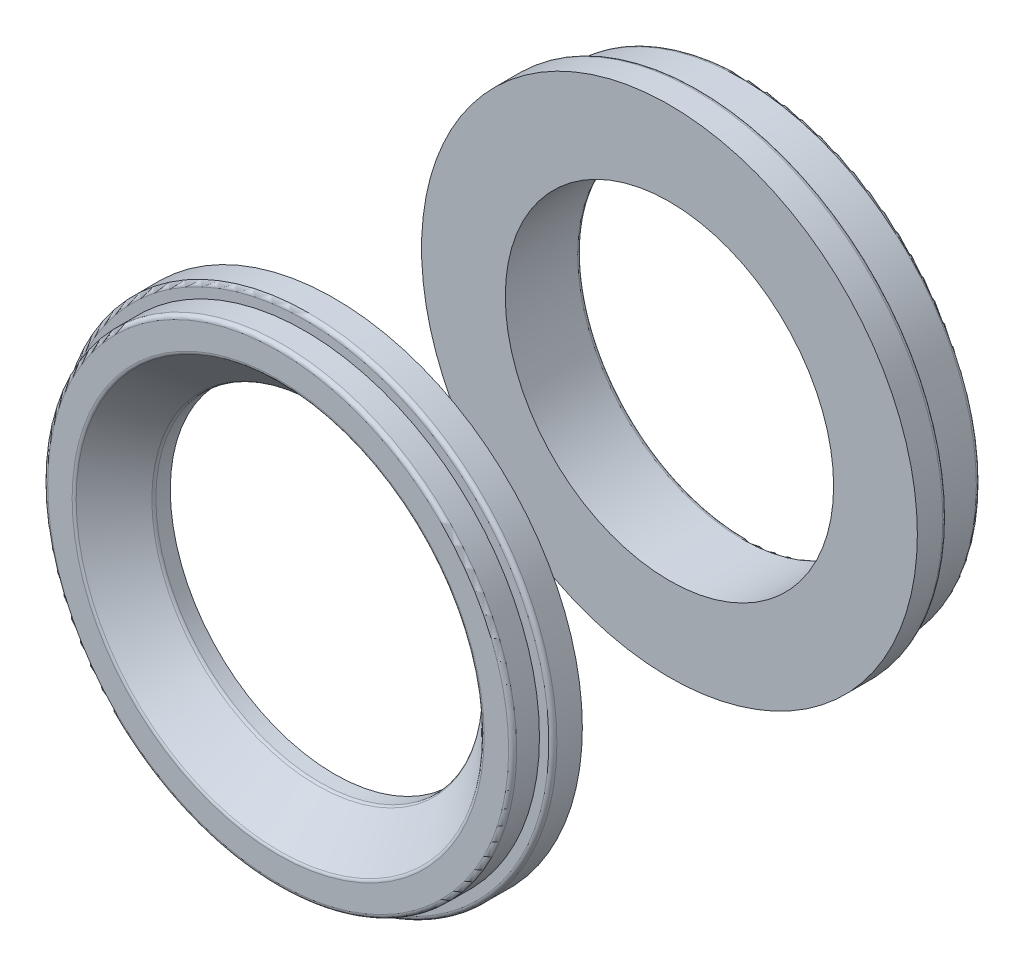
ISO-10303-21;
HEADER;
FILE_DESCRIPTION(('STEP AP214'),'2;1');
FILE_NAME('part.step','',(''),(''),'','','');
FILE_SCHEMA(('AUTOMOTIVE_DESIGN { 1 0 10303 214 1 1 1 1 }'));
ENDSEC;
DATA;
#1=APPLICATION_CONTEXT('core data for automotive mechanical design processes');
#2=APPLICATION_PROTOCOL_DEFINITION('international standard','automotive_design',2000,#1);
#3=PRODUCT_CONTEXT('',#1,'mechanical');
#4=PRODUCT('Part','Part','',(#3));
#5=PRODUCT_RELATED_PRODUCT_CATEGORY('part','',(#4));
#6=PRODUCT_DEFINITION_FORMATION('','',#4);
#7=PRODUCT_DEFINITION_CONTEXT('part definition',#1,'design');
#8=PRODUCT_DEFINITION('design','',#6,#7);
#9=PRODUCT_DEFINITION_SHAPE('','',#8);
#10=(LENGTH_UNIT() NAMED_UNIT(*) SI_UNIT(.MILLI.,.METRE.));
#11=(NAMED_UNIT(*) PLANE_ANGLE_UNIT() SI_UNIT($,.RADIAN.));
#12=(NAMED_UNIT(*) SI_UNIT($,.STERADIAN.) SOLID_ANGLE_UNIT());
#13=UNCERTAINTY_MEASURE_WITH_UNIT(LENGTH_MEASURE(1.E-05),#10,'distance_accuracy_value','');
#14=(GEOMETRIC_REPRESENTATION_CONTEXT(3) GLOBAL_UNCERTAINTY_ASSIGNED_CONTEXT((#13)) GLOBAL_UNIT_ASSIGNED_CONTEXT((#10,
#11,#12)) REPRESENTATION_CONTEXT('',''));
#15=CARTESIAN_POINT('',(0.,0.,0.));
#16=DIRECTION('',(0.,0.,1.));
#17=DIRECTION('',(1.,0.,0.));
#18=AXIS2_PLACEMENT_3D('',#15,#16,#17);
#19=CARTESIAN_POINT('',(0.,18.5,-35.2));
#20=DIRECTION('',(0.,0.,1.));
#21=DIRECTION('',(1.,0.,0.));
#22=AXIS2_PLACEMENT_3D('',#19,#20,#21);
#23=PLANE('',#22);
#24=CARTESIAN_POINT('',(0.,0.,-35.2));
#25=DIRECTION('',(0.,0.,1.));
#26=DIRECTION('',(1.,0.,0.));
#27=AXIS2_PLACEMENT_3D('',#24,#25,#26);
#28=CIRCLE('',#27,18.2);
#29=CARTESIAN_POINT('',(18.2,0.,-35.2));
#30=VERTEX_POINT('',#29);
#31=EDGE_CURVE('E72',#30,#30,#28,.F.);
#32=ORIENTED_EDGE('',*,*,#31,.T.);
#33=EDGE_LOOP('',(#32));
#34=FACE_BOUND('',#33,.T.);
#35=CARTESIAN_POINT('',(0.,0.,-35.2));
#36=DIRECTION('',(0.,0.,1.));
#37=DIRECTION('',(1.,0.,0.));
#38=AXIS2_PLACEMENT_3D('',#35,#36,#37);
#39=CIRCLE('',#38,17.5);
#40=CARTESIAN_POINT('',(17.5,0.,-35.2));
#41=VERTEX_POINT('',#40);
#42=EDGE_CURVE('E84',#41,#41,#39,.T.);
#43=ORIENTED_EDGE('',*,*,#42,.T.);
#44=EDGE_LOOP('',(#43));
#45=FACE_BOUND('',#44,.T.);
#46=ADVANCED_FACE('F52',(#34,#45),#23,.F.);
#47=CARTESIAN_POINT('',(0.,0.,24.4));
#48=DIRECTION('',(0.,0.,1.));
#49=DIRECTION('',(1.,0.,0.));
#50=AXIS2_PLACEMENT_3D('',#47,#48,#49);
#51=CYLINDRICAL_SURFACE('',#50,18.5);
#52=CARTESIAN_POINT('',(0.,0.,-34.9));
#53=DIRECTION('',(0.,0.,1.));
#54=DIRECTION('',(1.,0.,0.));
#55=AXIS2_PLACEMENT_3D('',#52,#53,#54);
#56=CIRCLE('',#55,18.5);
#57=CARTESIAN_POINT('',(18.5,0.,-34.9));
#58=VERTEX_POINT('',#57);
#59=EDGE_CURVE('E75',#58,#58,#56,.T.);
#60=ORIENTED_EDGE('',*,*,#59,.T.);
#61=EDGE_LOOP('',(#60));
#62=FACE_BOUND('',#61,.T.);
#63=CARTESIAN_POINT('',(0.,0.,-33.));
#64=DIRECTION('',(0.,0.,1.));
#65=DIRECTION('',(1.,0.,0.));
#66=AXIS2_PLACEMENT_3D('',#63,#64,#65);
#67=CIRCLE('',#66,18.5);
#68=CARTESIAN_POINT('',(18.5,0.,-33.));
#69=VERTEX_POINT('',#68);
#70=EDGE_CURVE('E78',#69,#69,#67,.T.);
#71=ORIENTED_EDGE('',*,*,#70,.F.);
#72=EDGE_LOOP('',(#71));
#73=FACE_BOUND('',#72,.T.);
#74=ADVANCED_FACE('F105',(#62,#73),#51,.T.);
#75=CARTESIAN_POINT('',(0.,18.5,-33.));
#76=DIRECTION('',(0.,0.,-1.));
#77=DIRECTION('',(-1.,0.,0.));
#78=AXIS2_PLACEMENT_3D('',#75,#76,#77);
#79=PLANE('',#78);
#80=CARTESIAN_POINT('',(0.,0.,-33.));
#81=DIRECTION('',(0.,0.,1.));
#82=DIRECTION('',(1.,0.,0.));
#83=AXIS2_PLACEMENT_3D('',#80,#81,#82);
#84=CIRCLE('',#83,12.25);
#85=CARTESIAN_POINT('',(12.25,0.,-33.));
#86=VERTEX_POINT('',#85);
#87=EDGE_CURVE('E81',#86,#86,#84,.T.);
#88=ORIENTED_EDGE('',*,*,#87,.F.);
#89=EDGE_LOOP('',(#88));
#90=FACE_BOUND('',#89,.T.);
#91=ORIENTED_EDGE('',*,*,#70,.T.);
#92=EDGE_LOOP('',(#91));
#93=FACE_BOUND('',#92,.T.);
#94=ADVANCED_FACE('F111',(#90,#93),#79,.F.);
#95=CARTESIAN_POINT('',(0.,0.,24.4));
#96=DIRECTION('',(0.,0.,1.));
#97=DIRECTION('',(1.,0.,0.));
#98=AXIS2_PLACEMENT_3D('',#95,#96,#97);
#99=CYLINDRICAL_SURFACE('',#98,12.25);
#100=CARTESIAN_POINT('',(0.,0.,-38.4));
#101=DIRECTION('',(0.,0.,1.));
#102=DIRECTION('',(1.,0.,0.));
#103=AXIS2_PLACEMENT_3D('',#100,#101,#102);
#104=CIRCLE('',#103,12.25);
#105=CARTESIAN_POINT('',(12.25,0.,-38.4));
#106=VERTEX_POINT('',#105);
#107=EDGE_CURVE('E11',#106,#106,#104,.F.);
#108=ORIENTED_EDGE('',*,*,#107,.T.);
#109=EDGE_LOOP('',(#108));
#110=FACE_BOUND('',#109,.T.);
#111=ORIENTED_EDGE('',*,*,#87,.T.);
#112=EDGE_LOOP('',(#111));
#113=FACE_BOUND('',#112,.T.);
#114=ADVANCED_FACE('F102',(#110,#113),#99,.F.);
#115=CARTESIAN_POINT('',(0.,17.5,-38.7));
#116=DIRECTION('',(0.,0.,1.));
#117=DIRECTION('',(1.,0.,0.));
#118=AXIS2_PLACEMENT_3D('',#115,#116,#117);
#119=PLANE('',#118);
#120=CARTESIAN_POINT('',(0.,0.,-38.7));
#121=DIRECTION('',(0.,0.,1.));
#122=DIRECTION('',(1.,0.,0.));
#123=AXIS2_PLACEMENT_3D('',#120,#121,#122);
#124=CIRCLE('',#123,12.55);
#125=CARTESIAN_POINT('',(12.55,0.,-38.7));
#126=VERTEX_POINT('',#125);
#127=EDGE_CURVE('E59',#126,#126,#124,.T.);
#128=ORIENTED_EDGE('',*,*,#127,.T.);
#129=EDGE_LOOP('',(#128));
#130=FACE_BOUND('',#129,.T.);
#131=CARTESIAN_POINT('',(0.,0.,-38.7));
#132=DIRECTION('',(0.,0.,1.));
#133=DIRECTION('',(1.,0.,0.));
#134=AXIS2_PLACEMENT_3D('',#131,#132,#133);
#135=CIRCLE('',#134,17.2);
#136=CARTESIAN_POINT('',(17.2,0.,-38.7));
#137=VERTEX_POINT('',#136);
#138=EDGE_CURVE('E63',#137,#137,#135,.F.);
#139=ORIENTED_EDGE('',*,*,#138,.T.);
#140=EDGE_LOOP('',(#139));
#141=FACE_BOUND('',#140,.T.);
#142=ADVANCED_FACE('F92',(#130,#141),#119,.F.);
#143=CARTESIAN_POINT('',(0.,0.,24.4));
#144=DIRECTION('',(0.,0.,1.));
#145=DIRECTION('',(1.,0.,0.));
#146=AXIS2_PLACEMENT_3D('',#143,#144,#145);
#147=CYLINDRICAL_SURFACE('',#146,17.5);
#148=CARTESIAN_POINT('',(0.,0.,-38.4));
#149=DIRECTION('',(0.,0.,1.));
#150=DIRECTION('',(1.,0.,0.));
#151=AXIS2_PLACEMENT_3D('',#148,#149,#150);
#152=CIRCLE('',#151,17.5);
#153=CARTESIAN_POINT('',(17.5,0.,-38.4));
#154=VERTEX_POINT('',#153);
#155=EDGE_CURVE('E67',#154,#154,#152,.T.);
#156=ORIENTED_EDGE('',*,*,#155,.T.);
#157=EDGE_LOOP('',(#156));
#158=FACE_BOUND('',#157,.T.);
#159=ORIENTED_EDGE('',*,*,#42,.F.);
#160=EDGE_LOOP('',(#159));
#161=FACE_BOUND('',#160,.T.);
#162=ADVANCED_FACE('F89',(#158,#161),#147,.T.);
#163=CARTESIAN_POINT('',(0.,0.,-34.9));
#164=DIRECTION('',(0.,0.,1.));
#165=DIRECTION('',(1.,0.,0.));
#166=AXIS2_PLACEMENT_3D('',#163,#164,#165);
#167=TOROIDAL_SURFACE('',#166,18.2,0.3);
#168=ORIENTED_EDGE('',*,*,#31,.F.);
#169=EDGE_LOOP('',(#168));
#170=FACE_BOUND('',#169,.T.);
#171=ORIENTED_EDGE('',*,*,#59,.F.);
#172=EDGE_LOOP('',(#171));
#173=FACE_BOUND('',#172,.T.);
#174=ADVANCED_FACE('F91',(#170,#173),#167,.T.);
#175=CARTESIAN_POINT('',(0.,0.,-38.4));
#176=DIRECTION('',(0.,0.,1.));
#177=DIRECTION('',(1.,0.,0.));
#178=AXIS2_PLACEMENT_3D('',#175,#176,#177);
#179=TOROIDAL_SURFACE('',#178,17.2,0.3);
#180=ORIENTED_EDGE('',*,*,#138,.F.);
#181=EDGE_LOOP('',(#180));
#182=FACE_BOUND('',#181,.T.);
#183=ORIENTED_EDGE('',*,*,#155,.F.);
#184=EDGE_LOOP('',(#183));
#185=FACE_BOUND('',#184,.T.);
#186=ADVANCED_FACE('F99',(#182,#185),#179,.T.);
#187=CARTESIAN_POINT('',(0.,0.,-38.4));
#188=DIRECTION('',(0.,0.,1.));
#189=DIRECTION('',(1.,0.,0.));
#190=AXIS2_PLACEMENT_3D('',#187,#188,#189);
#191=TOROIDAL_SURFACE('',#190,12.55,0.3);
#192=ORIENTED_EDGE('',*,*,#107,.F.);
#193=EDGE_LOOP('',(#192));
#194=FACE_BOUND('',#193,.T.);
#195=ORIENTED_EDGE('',*,*,#127,.F.);
#196=EDGE_LOOP('',(#195));
#197=FACE_BOUND('',#196,.T.);
#198=ADVANCED_FACE('F54',(#194,#197),#191,.T.);
#199=CLOSED_SHELL('',(#46,#74,#94,#114,#142,#162,#174,#186,#198));
#200=MANIFOLD_SOLID_BREP('B2',#199);
#201=CARTESIAN_POINT('',(0.,17.5,-3.8));
#202=DIRECTION('',(0.,0.,-1.));
#203=DIRECTION('',(-1.,0.,0.));
#204=AXIS2_PLACEMENT_3D('',#201,#202,#203);
#205=PLANE('',#204);
#206=CARTESIAN_POINT('',(0.,0.,-3.8));
#207=DIRECTION('',(0.,0.,-1.));
#208=DIRECTION('',(-1.,0.,0.));
#209=AXIS2_PLACEMENT_3D('',#206,#207,#208);
#210=CIRCLE('',#209,15.3742640687119);
#211=CARTESIAN_POINT('',(-15.3742640687119,0.,-3.8));
#212=VERTEX_POINT('',#211);
#213=EDGE_CURVE('E213',#212,#212,#210,.T.);
#214=ORIENTED_EDGE('',*,*,#213,.T.);
#215=EDGE_LOOP('',(#214));
#216=FACE_BOUND('',#215,.T.);
#217=CARTESIAN_POINT('',(0.,0.,-3.8));
#218=DIRECTION('',(0.,0.,-1.));
#219=DIRECTION('',(-1.,0.,0.));
#220=AXIS2_PLACEMENT_3D('',#217,#218,#219);
#221=CIRCLE('',#220,17.2);
#222=CARTESIAN_POINT('',(-17.2,0.,-3.8));
#223=VERTEX_POINT('',#222);
#224=EDGE_CURVE('E221',#223,#223,#221,.F.);
#225=ORIENTED_EDGE('',*,*,#224,.T.);
#226=EDGE_LOOP('',(#225));
#227=FACE_BOUND('',#226,.T.);
#228=ADVANCED_FACE('F198',(#216,#227),#205,.F.);
#229=CARTESIAN_POINT('',(0.,0.,24.4));
#230=DIRECTION('',(0.,0.,1.));
#231=DIRECTION('',(1.,0.,0.));
#232=AXIS2_PLACEMENT_3D('',#229,#230,#231);
#233=CYLINDRICAL_SURFACE('',#232,12.25);
#234=CARTESIAN_POINT('',(0.,0.,-6.92426406871193));
#235=DIRECTION('',(0.,0.,-1.));
#236=DIRECTION('',(-1.,0.,0.));
#237=AXIS2_PLACEMENT_3D('',#234,#235,#236);
#238=CIRCLE('',#237,12.25);
#239=CARTESIAN_POINT('',(-12.25,0.,-6.92426406871193));
#240=VERTEX_POINT('',#239);
#241=EDGE_CURVE('E205',#240,#240,#238,.F.);
#242=ORIENTED_EDGE('',*,*,#241,.T.);
#243=EDGE_LOOP('',(#242));
#244=FACE_BOUND('',#243,.T.);
#245=CARTESIAN_POINT('',(0.,0.,-8.));
#246=DIRECTION('',(0.,0.,1.));
#247=DIRECTION('',(1.,0.,0.));
#248=AXIS2_PLACEMENT_3D('',#245,#246,#247);
#249=CIRCLE('',#248,12.25);
#250=CARTESIAN_POINT('',(12.25,0.,-8.));
#251=VERTEX_POINT('',#250);
#252=EDGE_CURVE('E230',#251,#251,#249,.T.);
#253=ORIENTED_EDGE('',*,*,#252,.F.);
#254=EDGE_LOOP('',(#253));
#255=FACE_BOUND('',#254,.T.);
#256=ADVANCED_FACE('F258',(#244,#255),#233,.F.);
#257=CARTESIAN_POINT('',(0.,18.5,-8.));
#258=DIRECTION('',(0.,0.,1.));
#259=DIRECTION('',(1.,0.,0.));
#260=AXIS2_PLACEMENT_3D('',#257,#258,#259);
#261=PLANE('',#260);
#262=CARTESIAN_POINT('',(0.,0.,-8.));
#263=DIRECTION('',(0.,0.,1.));
#264=DIRECTION('',(1.,0.,0.));
#265=AXIS2_PLACEMENT_3D('',#262,#263,#264);
#266=CIRCLE('',#265,18.5);
#267=CARTESIAN_POINT('',(18.5,0.,-8.));
#268=VERTEX_POINT('',#267);
#269=EDGE_CURVE('E233',#268,#268,#266,.T.);
#270=ORIENTED_EDGE('',*,*,#269,.F.);
#271=EDGE_LOOP('',(#270));
#272=FACE_BOUND('',#271,.T.);
#273=ORIENTED_EDGE('',*,*,#252,.T.);
#274=EDGE_LOOP('',(#273));
#275=FACE_BOUND('',#274,.T.);
#276=ADVANCED_FACE('F254',(#272,#275),#261,.F.);
#277=CARTESIAN_POINT('',(0.,0.,24.4));
#278=DIRECTION('',(0.,0.,1.));
#279=DIRECTION('',(1.,0.,0.));
#280=AXIS2_PLACEMENT_3D('',#277,#278,#279);
#281=CYLINDRICAL_SURFACE('',#280,18.5);
#282=CARTESIAN_POINT('',(0.,0.,-6.1));
#283=DIRECTION('',(0.,0.,-1.));
#284=DIRECTION('',(-1.,0.,0.));
#285=AXIS2_PLACEMENT_3D('',#282,#283,#284);
#286=CIRCLE('',#285,18.5);
#287=CARTESIAN_POINT('',(-18.5,0.,-6.1));
#288=VERTEX_POINT('',#287);
#289=EDGE_CURVE('E224',#288,#288,#286,.T.);
#290=ORIENTED_EDGE('',*,*,#289,.T.);
#291=EDGE_LOOP('',(#290));
#292=FACE_BOUND('',#291,.T.);
#293=ORIENTED_EDGE('',*,*,#269,.T.);
#294=EDGE_LOOP('',(#293));
#295=FACE_BOUND('',#294,.T.);
#296=ADVANCED_FACE('F244',(#292,#295),#281,.T.);
#297=CARTESIAN_POINT('',(0.,17.5,-5.8));
#298=DIRECTION('',(0.,0.,-1.));
#299=DIRECTION('',(-1.,0.,0.));
#300=AXIS2_PLACEMENT_3D('',#297,#298,#299);
#301=PLANE('',#300);
#302=CARTESIAN_POINT('',(0.,0.,-5.8));
#303=DIRECTION('',(0.,0.,-1.));
#304=DIRECTION('',(-1.,0.,0.));
#305=AXIS2_PLACEMENT_3D('',#302,#303,#304);
#306=CIRCLE('',#305,18.2);
#307=CARTESIAN_POINT('',(-18.2,0.,-5.8));
#308=VERTEX_POINT('',#307);
#309=EDGE_CURVE('E227',#308,#308,#306,.F.);
#310=ORIENTED_EDGE('',*,*,#309,.T.);
#311=EDGE_LOOP('',(#310));
#312=FACE_BOUND('',#311,.T.);
#313=CARTESIAN_POINT('',(0.,0.,-5.8));
#314=DIRECTION('',(0.,0.,1.));
#315=DIRECTION('',(1.,0.,0.));
#316=AXIS2_PLACEMENT_3D('',#313,#314,#315);
#317=CIRCLE('',#316,17.5);
#318=CARTESIAN_POINT('',(17.5,0.,-5.8));
#319=VERTEX_POINT('',#318);
#320=EDGE_CURVE('E236',#319,#319,#317,.T.);
#321=ORIENTED_EDGE('',*,*,#320,.F.);
#322=EDGE_LOOP('',(#321));
#323=FACE_BOUND('',#322,.T.);
#324=ADVANCED_FACE('F242',(#312,#323),#301,.F.);
#325=CARTESIAN_POINT('',(0.,0.,24.4));
#326=DIRECTION('',(0.,0.,1.));
#327=DIRECTION('',(1.,0.,0.));
#328=AXIS2_PLACEMENT_3D('',#325,#326,#327);
#329=CYLINDRICAL_SURFACE('',#328,17.5);
#330=CARTESIAN_POINT('',(0.,0.,-4.1));
#331=DIRECTION('',(0.,0.,-1.));
#332=DIRECTION('',(-1.,0.,0.));
#333=AXIS2_PLACEMENT_3D('',#330,#331,#332);
#334=CIRCLE('',#333,17.5);
#335=CARTESIAN_POINT('',(-17.5,0.,-4.1));
#336=VERTEX_POINT('',#335);
#337=EDGE_CURVE('E218',#336,#336,#334,.T.);
#338=ORIENTED_EDGE('',*,*,#337,.T.);
#339=EDGE_LOOP('',(#338));
#340=FACE_BOUND('',#339,.T.);
#341=ORIENTED_EDGE('',*,*,#320,.T.);
#342=EDGE_LOOP('',(#341));
#343=FACE_BOUND('',#342,.T.);
#344=ADVANCED_FACE('F240',(#340,#343),#329,.T.);
#345=CARTESIAN_POINT('',(0.,0.,-6.8));
#346=DIRECTION('',(0.,0.,1.));
#347=DIRECTION('',(1.,0.,0.));
#348=AXIS2_PLACEMENT_3D('',#345,#346,#347);
#349=CONICAL_SURFACE('',#348,12.25,0.78539816339745);
#350=CARTESIAN_POINT('',(0.,0.,-6.71213203435597));
#351=DIRECTION('',(0.,0.,1.));
#352=DIRECTION('',(1.,0.,0.));
#353=AXIS2_PLACEMENT_3D('',#350,#351,#352);
#354=CIRCLE('',#353,12.337867965644);
#355=CARTESIAN_POINT('',(12.337867965644,0.,-6.71213203435597));
#356=VERTEX_POINT('',#355);
#357=EDGE_CURVE('E51',#356,#356,#354,.F.);
#358=ORIENTED_EDGE('',*,*,#357,.T.);
#359=EDGE_LOOP('',(#358));
#360=FACE_BOUND('',#359,.T.);
#361=CARTESIAN_POINT('',(0.,0.,-3.88786796564404));
#362=DIRECTION('',(0.,0.,1.));
#363=DIRECTION('',(1.,0.,0.));
#364=AXIS2_PLACEMENT_3D('',#361,#362,#363);
#365=CIRCLE('',#364,15.162132034356);
#366=CARTESIAN_POINT('',(15.162132034356,0.,-3.88786796564404));
#367=VERTEX_POINT('',#366);
#368=EDGE_CURVE('E209',#367,#367,#365,.T.);
#369=ORIENTED_EDGE('',*,*,#368,.T.);
#370=EDGE_LOOP('',(#369));
#371=FACE_BOUND('',#370,.T.);
#372=ADVANCED_FACE('F251',(#360,#371),#349,.F.);
#373=CARTESIAN_POINT('',(0.,0.,-6.1));
#374=DIRECTION('',(0.,0.,-1.));
#375=DIRECTION('',(-1.,0.,0.));
#376=AXIS2_PLACEMENT_3D('',#373,#374,#375);
#377=TOROIDAL_SURFACE('',#376,18.2,0.3);
#378=ORIENTED_EDGE('',*,*,#289,.F.);
#379=EDGE_LOOP('',(#378));
#380=FACE_BOUND('',#379,.T.);
#381=ORIENTED_EDGE('',*,*,#309,.F.);
#382=EDGE_LOOP('',(#381));
#383=FACE_BOUND('',#382,.T.);
#384=ADVANCED_FACE('F273',(#380,#383),#377,.T.);
#385=CARTESIAN_POINT('',(0.,0.,-4.1));
#386=DIRECTION('',(0.,0.,-1.));
#387=DIRECTION('',(-1.,0.,0.));
#388=AXIS2_PLACEMENT_3D('',#385,#386,#387);
#389=TOROIDAL_SURFACE('',#388,17.2,0.3);
#390=ORIENTED_EDGE('',*,*,#337,.F.);
#391=EDGE_LOOP('',(#390));
#392=FACE_BOUND('',#391,.T.);
#393=ORIENTED_EDGE('',*,*,#224,.F.);
#394=EDGE_LOOP('',(#393));
#395=FACE_BOUND('',#394,.T.);
#396=ADVANCED_FACE('F276',(#392,#395),#389,.T.);
#397=CARTESIAN_POINT('',(0.,0.,-4.1));
#398=DIRECTION('',(0.,0.,-1.));
#399=DIRECTION('',(-1.,0.,0.));
#400=AXIS2_PLACEMENT_3D('',#397,#398,#399);
#401=TOROIDAL_SURFACE('',#400,15.3742640687119,0.3);
#402=ORIENTED_EDGE('',*,*,#368,.F.);
#403=EDGE_LOOP('',(#402));
#404=FACE_BOUND('',#403,.T.);
#405=ORIENTED_EDGE('',*,*,#213,.F.);
#406=EDGE_LOOP('',(#405));
#407=FACE_BOUND('',#406,.T.);
#408=ADVANCED_FACE('F279',(#404,#407),#401,.T.);
#409=CARTESIAN_POINT('',(0.,0.,-6.92426406871193));
#410=DIRECTION('',(0.,0.,-1.));
#411=DIRECTION('',(-1.,0.,0.));
#412=AXIS2_PLACEMENT_3D('',#409,#410,#411);
#413=TOROIDAL_SURFACE('',#412,12.55,0.3);
#414=ORIENTED_EDGE('',*,*,#357,.F.);
#415=EDGE_LOOP('',(#414));
#416=FACE_BOUND('',#415,.T.);
#417=ORIENTED_EDGE('',*,*,#241,.F.);
#418=EDGE_LOOP('',(#417));
#419=FACE_BOUND('',#418,.T.);
#420=ADVANCED_FACE('F200',(#416,#419),#413,.T.);
#421=CLOSED_SHELL('',(#228,#256,#276,#296,#324,#344,#372,#384,#396,#408,#420));
#422=MANIFOLD_SOLID_BREP('B6',#421);
#423=ADVANCED_BREP_SHAPE_REPRESENTATION('',(#18,#200,#422),#14);
#424=SHAPE_DEFINITION_REPRESENTATION(#9,#423);
ENDSEC;
END-ISO-10303-21;
